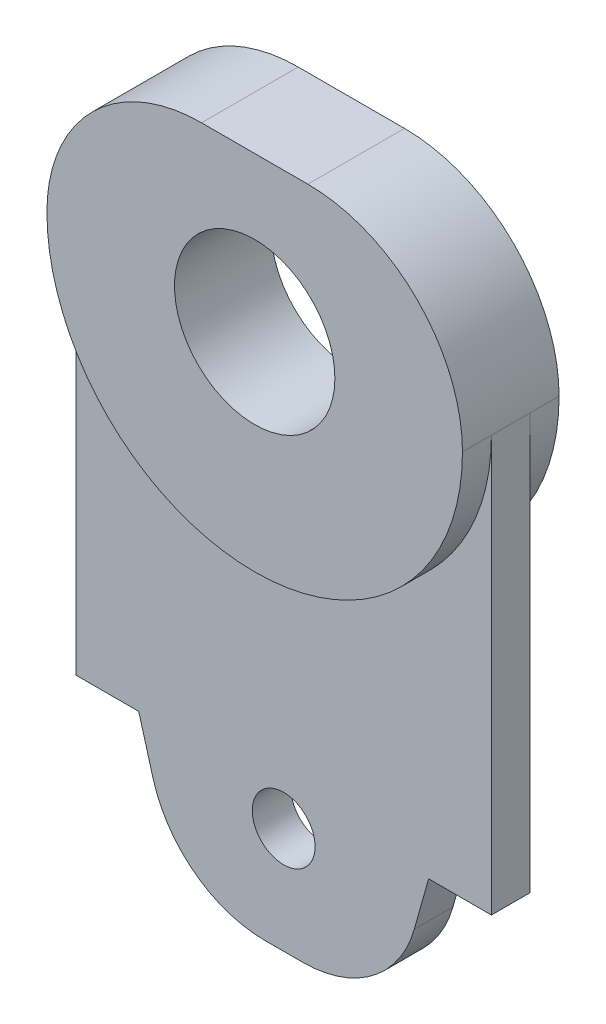
ISO-10303-21;
HEADER;
FILE_DESCRIPTION(('STEP AP214'),'2;1');
FILE_NAME('part.step','',(''),(''),'','','');
FILE_SCHEMA(('AUTOMOTIVE_DESIGN { 1 0 10303 214 1 1 1 1 }'));
ENDSEC;
DATA;
#1=APPLICATION_CONTEXT('core data for automotive mechanical design processes');
#2=APPLICATION_PROTOCOL_DEFINITION('international standard','automotive_design',2000,#1);
#3=PRODUCT_CONTEXT('',#1,'mechanical');
#4=PRODUCT('Part','Part','',(#3));
#5=PRODUCT_RELATED_PRODUCT_CATEGORY('part','',(#4));
#6=PRODUCT_DEFINITION_FORMATION('','',#4);
#7=PRODUCT_DEFINITION_CONTEXT('part definition',#1,'design');
#8=PRODUCT_DEFINITION('design','',#6,#7);
#9=PRODUCT_DEFINITION_SHAPE('','',#8);
#10=(LENGTH_UNIT() NAMED_UNIT(*) SI_UNIT(.MILLI.,.METRE.));
#11=(NAMED_UNIT(*) PLANE_ANGLE_UNIT() SI_UNIT($,.RADIAN.));
#12=(NAMED_UNIT(*) SI_UNIT($,.STERADIAN.) SOLID_ANGLE_UNIT());
#13=UNCERTAINTY_MEASURE_WITH_UNIT(LENGTH_MEASURE(1.E-05),#10,'distance_accuracy_value','');
#14=(GEOMETRIC_REPRESENTATION_CONTEXT(3) GLOBAL_UNCERTAINTY_ASSIGNED_CONTEXT((#13)) GLOBAL_UNIT_ASSIGNED_CONTEXT((#10,
#11,#12)) REPRESENTATION_CONTEXT('',''));
#15=CARTESIAN_POINT('',(0.,0.,0.));
#16=DIRECTION('',(0.,0.,1.));
#17=DIRECTION('',(1.,0.,0.));
#18=AXIS2_PLACEMENT_3D('',#15,#16,#17);
#19=CARTESIAN_POINT('',(8.,21.5,2.));
#20=DIRECTION('',(0.,0.,-1.));
#21=DIRECTION('',(-1.,0.,0.));
#22=AXIS2_PLACEMENT_3D('',#19,#20,#21);
#23=PLANE('',#22);
#24=CARTESIAN_POINT('',(10.75,21.5,2.));
#25=DIRECTION('',(0.,0.,1.));
#26=DIRECTION('',(1.,0.,0.));
#27=AXIS2_PLACEMENT_3D('',#24,#25,#26);
#28=CIRCLE('',#27,10.75);
#29=CARTESIAN_POINT('',(0.,21.5,2.));
#30=VERTEX_POINT('',#29);
#31=CARTESIAN_POINT('',(21.5,21.5,2.));
#32=VERTEX_POINT('',#31);
#33=EDGE_CURVE('E53',#30,#32,#28,.T.);
#34=ORIENTED_EDGE('',*,*,#33,.F.);
#35=DIRECTION('',(0.,-1.,0.));
#36=VECTOR('',#35,1.);
#37=CARTESIAN_POINT('',(0.,0.,2.));
#38=LINE('',#37,#36);
#39=CARTESIAN_POINT('',(0.,0.,2.));
#40=VERTEX_POINT('',#39);
#41=EDGE_CURVE('E167',#30,#40,#38,.T.);
#42=ORIENTED_EDGE('',*,*,#41,.T.);
#43=DIRECTION('',(1.,0.,0.));
#44=VECTOR('',#43,1.);
#45=CARTESIAN_POINT('',(0.,0.,2.));
#46=LINE('',#45,#44);
#47=CARTESIAN_POINT('',(3.25,0.,2.));
#48=VERTEX_POINT('',#47);
#49=EDGE_CURVE('E103',#40,#48,#46,.T.);
#50=ORIENTED_EDGE('',*,*,#49,.T.);
#51=DIRECTION('',(0.271541803681509,-0.96242664595978,0.));
#52=VECTOR('',#51,1.);
#53=CARTESIAN_POINT('',(3.25,0.,2.));
#54=LINE('',#53,#52);
#55=CARTESIAN_POINT('',(3.9918243390894,-2.62925082208903,2.));
#56=VERTEX_POINT('',#55);
#57=EDGE_CURVE('E195',#48,#56,#54,.T.);
#58=ORIENTED_EDGE('',*,*,#57,.T.);
#59=CARTESIAN_POINT('',(9.76638421484809,-1.,2.));
#60=DIRECTION('',(0.,0.,1.));
#61=DIRECTION('',(1.,0.,0.));
#62=AXIS2_PLACEMENT_3D('',#59,#60,#61);
#63=CIRCLE('',#62,6.);
#64=CARTESIAN_POINT('',(9.76638421484813,-7.,2.));
#65=VERTEX_POINT('',#64);
#66=EDGE_CURVE('E211',#56,#65,#63,.T.);
#67=ORIENTED_EDGE('',*,*,#66,.T.);
#68=DIRECTION('',(1.,0.,0.));
#69=VECTOR('',#68,1.);
#70=CARTESIAN_POINT('',(9.76638421484813,-7.,2.));
#71=LINE('',#70,#69);
#72=CARTESIAN_POINT('',(11.7336157851519,-7.,2.));
#73=VERTEX_POINT('',#72);
#74=EDGE_CURVE('E210',#65,#73,#71,.T.);
#75=ORIENTED_EDGE('',*,*,#74,.T.);
#76=CARTESIAN_POINT('',(11.7336157851519,-0.999999999999999,2.));
#77=DIRECTION('',(0.,0.,1.));
#78=DIRECTION('',(-1.,0.,0.));
#79=AXIS2_PLACEMENT_3D('',#76,#77,#78);
#80=CIRCLE('',#79,6.);
#81=CARTESIAN_POINT('',(17.5081756609106,-2.62925082208903,2.));
#82=VERTEX_POINT('',#81);
#83=EDGE_CURVE('E128',#73,#82,#80,.T.);
#84=ORIENTED_EDGE('',*,*,#83,.T.);
#85=DIRECTION('',(0.27154180368151,0.96242664595978,0.));
#86=VECTOR('',#85,1.);
#87=CARTESIAN_POINT('',(18.25,0.,2.));
#88=LINE('',#87,#86);
#89=CARTESIAN_POINT('',(18.25,0.,2.));
#90=VERTEX_POINT('',#89);
#91=EDGE_CURVE('E122',#82,#90,#88,.T.);
#92=ORIENTED_EDGE('',*,*,#91,.T.);
#93=DIRECTION('',(1.,0.,0.));
#94=VECTOR('',#93,1.);
#95=CARTESIAN_POINT('',(18.25,0.,2.));
#96=LINE('',#95,#94);
#97=CARTESIAN_POINT('',(21.5,0.,2.));
#98=VERTEX_POINT('',#97);
#99=EDGE_CURVE('E126',#90,#98,#96,.T.);
#100=ORIENTED_EDGE('',*,*,#99,.T.);
#101=DIRECTION('',(0.,1.,0.));
#102=VECTOR('',#101,1.);
#103=CARTESIAN_POINT('',(21.5,0.,2.));
#104=LINE('',#103,#102);
#105=EDGE_CURVE('E142',#98,#32,#104,.T.);
#106=ORIENTED_EDGE('',*,*,#105,.T.);
#107=EDGE_LOOP('',(#34,#42,#50,#58,#67,#75,#84,#92,#100,#106));
#108=FACE_BOUND('',#107,.T.);
#109=CARTESIAN_POINT('',(10.75,-1.5,2.));
#110=DIRECTION('',(0.,0.,1.));
#111=DIRECTION('',(1.,0.,0.));
#112=AXIS2_PLACEMENT_3D('',#109,#110,#111);
#113=CIRCLE('',#112,1.625);
#114=CARTESIAN_POINT('',(12.375,-1.5,2.));
#115=VERTEX_POINT('',#114);
#116=EDGE_CURVE('E152',#115,#115,#113,.T.);
#117=ORIENTED_EDGE('',*,*,#116,.F.);
#118=EDGE_LOOP('',(#117));
#119=FACE_BOUND('',#118,.T.);
#120=ADVANCED_FACE('F36',(#108,#119),#23,.F.);
#121=CARTESIAN_POINT('',(8.,21.5,0.));
#122=DIRECTION('',(0.,0.,-1.));
#123=DIRECTION('',(-1.,0.,0.));
#124=AXIS2_PLACEMENT_3D('',#121,#122,#123);
#125=PLANE('',#124);
#126=CARTESIAN_POINT('',(10.75,-1.5,0.));
#127=DIRECTION('',(0.,0.,1.));
#128=DIRECTION('',(1.,0.,0.));
#129=AXIS2_PLACEMENT_3D('',#126,#127,#128);
#130=CIRCLE('',#129,1.625);
#131=CARTESIAN_POINT('',(12.375,-1.5,0.));
#132=VERTEX_POINT('',#131);
#133=EDGE_CURVE('E218',#132,#132,#130,.T.);
#134=ORIENTED_EDGE('',*,*,#133,.T.);
#135=EDGE_LOOP('',(#134));
#136=FACE_BOUND('',#135,.T.);
#137=DIRECTION('',(0.,-1.,0.));
#138=VECTOR('',#137,1.);
#139=CARTESIAN_POINT('',(0.,0.,0.));
#140=LINE('',#139,#138);
#141=CARTESIAN_POINT('',(0.,21.5,0.));
#142=VERTEX_POINT('',#141);
#143=CARTESIAN_POINT('',(0.,0.,0.));
#144=VERTEX_POINT('',#143);
#145=EDGE_CURVE('E148',#142,#144,#140,.T.);
#146=ORIENTED_EDGE('',*,*,#145,.F.);
#147=CARTESIAN_POINT('',(10.75,21.5,0.));
#148=DIRECTION('',(0.,0.,1.));
#149=DIRECTION('',(1.,0.,0.));
#150=AXIS2_PLACEMENT_3D('',#147,#148,#149);
#151=CIRCLE('',#150,10.75);
#152=CARTESIAN_POINT('',(21.5,21.5,0.));
#153=VERTEX_POINT('',#152);
#154=EDGE_CURVE('E228',#142,#153,#151,.T.);
#155=ORIENTED_EDGE('',*,*,#154,.T.);
#156=DIRECTION('',(0.,1.,0.));
#157=VECTOR('',#156,1.);
#158=CARTESIAN_POINT('',(21.5,0.,0.));
#159=LINE('',#158,#157);
#160=CARTESIAN_POINT('',(21.5,0.,0.));
#161=VERTEX_POINT('',#160);
#162=EDGE_CURVE('E164',#161,#153,#159,.T.);
#163=ORIENTED_EDGE('',*,*,#162,.F.);
#164=DIRECTION('',(1.,0.,0.));
#165=VECTOR('',#164,1.);
#166=CARTESIAN_POINT('',(18.25,0.,0.));
#167=LINE('',#166,#165);
#168=CARTESIAN_POINT('',(18.25,0.,0.));
#169=VERTEX_POINT('',#168);
#170=EDGE_CURVE('E87',#169,#161,#167,.T.);
#171=ORIENTED_EDGE('',*,*,#170,.F.);
#172=DIRECTION('',(0.27154180368151,0.96242664595978,0.));
#173=VECTOR('',#172,1.);
#174=CARTESIAN_POINT('',(18.25,0.,0.));
#175=LINE('',#174,#173);
#176=CARTESIAN_POINT('',(17.5081756609106,-2.62925082208903,0.));
#177=VERTEX_POINT('',#176);
#178=EDGE_CURVE('E136',#177,#169,#175,.T.);
#179=ORIENTED_EDGE('',*,*,#178,.F.);
#180=CARTESIAN_POINT('',(11.7336157851519,-0.999999999999999,0.));
#181=DIRECTION('',(0.,0.,1.));
#182=DIRECTION('',(-1.,0.,0.));
#183=AXIS2_PLACEMENT_3D('',#180,#181,#182);
#184=CIRCLE('',#183,6.);
#185=CARTESIAN_POINT('',(11.7336157851519,-7.,0.));
#186=VERTEX_POINT('',#185);
#187=EDGE_CURVE('E160',#186,#177,#184,.T.);
#188=ORIENTED_EDGE('',*,*,#187,.F.);
#189=DIRECTION('',(1.,0.,0.));
#190=VECTOR('',#189,1.);
#191=CARTESIAN_POINT('',(9.76638421484813,-7.,0.));
#192=LINE('',#191,#190);
#193=CARTESIAN_POINT('',(9.76638421484813,-7.,0.));
#194=VERTEX_POINT('',#193);
#195=EDGE_CURVE('E158',#194,#186,#192,.T.);
#196=ORIENTED_EDGE('',*,*,#195,.F.);
#197=CARTESIAN_POINT('',(9.76638421484809,-1.,0.));
#198=DIRECTION('',(0.,0.,1.));
#199=DIRECTION('',(1.,0.,0.));
#200=AXIS2_PLACEMENT_3D('',#197,#198,#199);
#201=CIRCLE('',#200,6.);
#202=CARTESIAN_POINT('',(3.9918243390894,-2.62925082208903,0.));
#203=VERTEX_POINT('',#202);
#204=EDGE_CURVE('E156',#203,#194,#201,.T.);
#205=ORIENTED_EDGE('',*,*,#204,.F.);
#206=DIRECTION('',(0.271541803681509,-0.96242664595978,0.));
#207=VECTOR('',#206,1.);
#208=CARTESIAN_POINT('',(3.25,0.,0.));
#209=LINE('',#208,#207);
#210=CARTESIAN_POINT('',(3.25,0.,0.));
#211=VERTEX_POINT('',#210);
#212=EDGE_CURVE('E154',#211,#203,#209,.T.);
#213=ORIENTED_EDGE('',*,*,#212,.F.);
#214=DIRECTION('',(1.,0.,0.));
#215=VECTOR('',#214,1.);
#216=CARTESIAN_POINT('',(0.,0.,0.));
#217=LINE('',#216,#215);
#218=EDGE_CURVE('E151',#144,#211,#217,.T.);
#219=ORIENTED_EDGE('',*,*,#218,.F.);
#220=EDGE_LOOP('',(#146,#155,#163,#171,#179,#188,#196,#205,#213,#219));
#221=FACE_BOUND('',#220,.T.);
#222=ADVANCED_FACE('F199',(#136,#221),#125,.T.);
#223=CARTESIAN_POINT('',(0.,0.,2.));
#224=DIRECTION('',(1.,0.,0.));
#225=DIRECTION('',(0.,0.,-1.));
#226=AXIS2_PLACEMENT_3D('',#223,#224,#225);
#227=PLANE('',#226);
#228=ORIENTED_EDGE('',*,*,#145,.T.);
#229=DIRECTION('',(0.,0.,-1.));
#230=VECTOR('',#229,1.);
#231=CARTESIAN_POINT('',(0.,0.,2.));
#232=LINE('',#231,#230);
#233=EDGE_CURVE('E11',#40,#144,#232,.T.);
#234=ORIENTED_EDGE('',*,*,#233,.F.);
#235=ORIENTED_EDGE('',*,*,#41,.F.);
#236=DIRECTION('',(0.,0.,-1.));
#237=VECTOR('',#236,1.);
#238=CARTESIAN_POINT('',(0.,21.5,2.));
#239=LINE('',#238,#237);
#240=EDGE_CURVE('E144',#30,#142,#239,.T.);
#241=ORIENTED_EDGE('',*,*,#240,.T.);
#242=EDGE_LOOP('',(#228,#234,#235,#241));
#243=FACE_BOUND('',#242,.T.);
#244=ADVANCED_FACE('F38',(#243),#227,.F.);
#245=CARTESIAN_POINT('',(0.,0.,2.));
#246=DIRECTION('',(0.,1.,0.));
#247=DIRECTION('',(0.,0.,1.));
#248=AXIS2_PLACEMENT_3D('',#245,#246,#247);
#249=PLANE('',#248);
#250=ORIENTED_EDGE('',*,*,#218,.T.);
#251=DIRECTION('',(0.,0.,-1.));
#252=VECTOR('',#251,1.);
#253=CARTESIAN_POINT('',(3.25,0.,2.));
#254=LINE('',#253,#252);
#255=EDGE_CURVE('E45',#48,#211,#254,.T.);
#256=ORIENTED_EDGE('',*,*,#255,.F.);
#257=ORIENTED_EDGE('',*,*,#49,.F.);
#258=ORIENTED_EDGE('',*,*,#233,.T.);
#259=EDGE_LOOP('',(#250,#256,#257,#258));
#260=FACE_BOUND('',#259,.T.);
#261=ADVANCED_FACE('F474',(#260),#249,.F.);
#262=CARTESIAN_POINT('',(3.25,0.,2.));
#263=DIRECTION('',(0.962426645959781,0.271541803681509,0.));
#264=DIRECTION('',(-0.271541803681509,0.962426645959781,0.));
#265=AXIS2_PLACEMENT_3D('',#262,#263,#264);
#266=PLANE('',#265);
#267=ORIENTED_EDGE('',*,*,#212,.T.);
#268=DIRECTION('',(0.,0.,-1.));
#269=VECTOR('',#268,1.);
#270=CARTESIAN_POINT('',(3.9918243390894,-2.62925082208903,2.));
#271=LINE('',#270,#269);
#272=EDGE_CURVE('E187',#56,#203,#271,.T.);
#273=ORIENTED_EDGE('',*,*,#272,.F.);
#274=ORIENTED_EDGE('',*,*,#57,.F.);
#275=ORIENTED_EDGE('',*,*,#255,.T.);
#276=EDGE_LOOP('',(#267,#273,#274,#275));
#277=FACE_BOUND('',#276,.T.);
#278=ADVANCED_FACE('F193',(#277),#266,.F.);
#279=CARTESIAN_POINT('',(9.76638421484809,-1.,2.));
#280=DIRECTION('',(0.,0.,-1.));
#281=DIRECTION('',(-1.,0.,0.));
#282=AXIS2_PLACEMENT_3D('',#279,#280,#281);
#283=CYLINDRICAL_SURFACE('',#282,6.);
#284=ORIENTED_EDGE('',*,*,#204,.T.);
#285=DIRECTION('',(0.,0.,-1.));
#286=VECTOR('',#285,1.);
#287=CARTESIAN_POINT('',(9.76638421484813,-7.,2.));
#288=LINE('',#287,#286);
#289=EDGE_CURVE('E184',#65,#194,#288,.T.);
#290=ORIENTED_EDGE('',*,*,#289,.F.);
#291=ORIENTED_EDGE('',*,*,#66,.F.);
#292=ORIENTED_EDGE('',*,*,#272,.T.);
#293=EDGE_LOOP('',(#284,#290,#291,#292));
#294=FACE_BOUND('',#293,.T.);
#295=ADVANCED_FACE('F204',(#294),#283,.T.);
#296=CARTESIAN_POINT('',(9.76638421484813,-7.,2.));
#297=DIRECTION('',(0.,1.,0.));
#298=DIRECTION('',(0.,0.,1.));
#299=AXIS2_PLACEMENT_3D('',#296,#297,#298);
#300=PLANE('',#299);
#301=ORIENTED_EDGE('',*,*,#195,.T.);
#302=DIRECTION('',(0.,0.,-1.));
#303=VECTOR('',#302,1.);
#304=CARTESIAN_POINT('',(11.7336157851519,-7.,2.));
#305=LINE('',#304,#303);
#306=EDGE_CURVE('E181',#73,#186,#305,.T.);
#307=ORIENTED_EDGE('',*,*,#306,.F.);
#308=ORIENTED_EDGE('',*,*,#74,.F.);
#309=ORIENTED_EDGE('',*,*,#289,.T.);
#310=EDGE_LOOP('',(#301,#307,#308,#309));
#311=FACE_BOUND('',#310,.T.);
#312=ADVANCED_FACE('F208',(#311),#300,.F.);
#313=CARTESIAN_POINT('',(11.7336157851519,-0.999999999999999,2.));
#314=DIRECTION('',(0.,0.,-1.));
#315=DIRECTION('',(-1.,0.,0.));
#316=AXIS2_PLACEMENT_3D('',#313,#314,#315);
#317=CYLINDRICAL_SURFACE('',#316,6.);
#318=ORIENTED_EDGE('',*,*,#187,.T.);
#319=DIRECTION('',(0.,0.,-1.));
#320=VECTOR('',#319,1.);
#321=CARTESIAN_POINT('',(17.5081756609106,-2.62925082208903,2.));
#322=LINE('',#321,#320);
#323=EDGE_CURVE('E137',#82,#177,#322,.T.);
#324=ORIENTED_EDGE('',*,*,#323,.F.);
#325=ORIENTED_EDGE('',*,*,#83,.F.);
#326=ORIENTED_EDGE('',*,*,#306,.T.);
#327=EDGE_LOOP('',(#318,#324,#325,#326));
#328=FACE_BOUND('',#327,.T.);
#329=ADVANCED_FACE('F440',(#328),#317,.T.);
#330=CARTESIAN_POINT('',(18.25,0.,2.));
#331=DIRECTION('',(-0.962426645959781,0.27154180368151,0.));
#332=DIRECTION('',(-0.27154180368151,-0.96242664595978,0.));
#333=AXIS2_PLACEMENT_3D('',#330,#331,#332);
#334=PLANE('',#333);
#335=ORIENTED_EDGE('',*,*,#178,.T.);
#336=DIRECTION('',(0.,0.,-1.));
#337=VECTOR('',#336,1.);
#338=CARTESIAN_POINT('',(18.25,0.,2.));
#339=LINE('',#338,#337);
#340=EDGE_CURVE('E133',#90,#169,#339,.T.);
#341=ORIENTED_EDGE('',*,*,#340,.F.);
#342=ORIENTED_EDGE('',*,*,#91,.F.);
#343=ORIENTED_EDGE('',*,*,#323,.T.);
#344=EDGE_LOOP('',(#335,#341,#342,#343));
#345=FACE_BOUND('',#344,.T.);
#346=ADVANCED_FACE('F134',(#345),#334,.F.);
#347=CARTESIAN_POINT('',(18.25,0.,2.));
#348=DIRECTION('',(0.,1.,0.));
#349=DIRECTION('',(0.,0.,1.));
#350=AXIS2_PLACEMENT_3D('',#347,#348,#349);
#351=PLANE('',#350);
#352=ORIENTED_EDGE('',*,*,#170,.T.);
#353=DIRECTION('',(0.,0.,-1.));
#354=VECTOR('',#353,1.);
#355=CARTESIAN_POINT('',(21.5,0.,2.));
#356=LINE('',#355,#354);
#357=EDGE_CURVE('E138',#98,#161,#356,.T.);
#358=ORIENTED_EDGE('',*,*,#357,.F.);
#359=ORIENTED_EDGE('',*,*,#99,.F.);
#360=ORIENTED_EDGE('',*,*,#340,.T.);
#361=EDGE_LOOP('',(#352,#358,#359,#360));
#362=FACE_BOUND('',#361,.T.);
#363=ADVANCED_FACE('F140',(#362),#351,.F.);
#364=CARTESIAN_POINT('',(21.5,0.,2.));
#365=DIRECTION('',(-1.,0.,0.));
#366=DIRECTION('',(0.,0.,1.));
#367=AXIS2_PLACEMENT_3D('',#364,#365,#366);
#368=PLANE('',#367);
#369=ORIENTED_EDGE('',*,*,#162,.T.);
#370=DIRECTION('',(0.,0.,-1.));
#371=VECTOR('',#370,1.);
#372=CARTESIAN_POINT('',(21.5,21.5,2.));
#373=LINE('',#372,#371);
#374=EDGE_CURVE('E176',#32,#153,#373,.T.);
#375=ORIENTED_EDGE('',*,*,#374,.F.);
#376=ORIENTED_EDGE('',*,*,#105,.F.);
#377=ORIENTED_EDGE('',*,*,#357,.T.);
#378=EDGE_LOOP('',(#369,#375,#376,#377));
#379=FACE_BOUND('',#378,.T.);
#380=ADVANCED_FACE('F322',(#379),#368,.F.);
#381=CARTESIAN_POINT('',(13.5,21.5,2.));
#382=DIRECTION('',(0.,0.,-1.));
#383=DIRECTION('',(-1.,0.,0.));
#384=AXIS2_PLACEMENT_3D('',#381,#382,#383);
#385=CYLINDRICAL_SURFACE('',#384,8.);
#386=ORIENTED_EDGE('',*,*,#374,.T.);
#387=DIRECTION('',(0.,0.,1.));
#388=VECTOR('',#387,1.);
#389=CARTESIAN_POINT('',(21.5,21.5,-1.5));
#390=LINE('',#389,#388);
#391=CARTESIAN_POINT('',(21.5,21.5,-1.5));
#392=VERTEX_POINT('',#391);
#393=EDGE_CURVE('E95',#392,#153,#390,.T.);
#394=ORIENTED_EDGE('',*,*,#393,.F.);
#395=CARTESIAN_POINT('',(13.5,21.5,-1.5));
#396=DIRECTION('',(0.,0.,1.));
#397=DIRECTION('',(1.,0.,0.));
#398=AXIS2_PLACEMENT_3D('',#395,#396,#397);
#399=CIRCLE('',#398,8.);
#400=CARTESIAN_POINT('',(13.5,29.5,-1.5));
#401=VERTEX_POINT('',#400);
#402=EDGE_CURVE('E237',#392,#401,#399,.T.);
#403=ORIENTED_EDGE('',*,*,#402,.T.);
#404=DIRECTION('',(0.,0.,-1.));
#405=VECTOR('',#404,1.);
#406=CARTESIAN_POINT('',(13.5,29.5,2.));
#407=LINE('',#406,#405);
#408=CARTESIAN_POINT('',(13.5,29.5,3.5));
#409=VERTEX_POINT('',#408);
#410=EDGE_CURVE('E173',#409,#401,#407,.T.);
#411=ORIENTED_EDGE('',*,*,#410,.F.);
#412=CARTESIAN_POINT('',(13.5,21.5,3.5));
#413=DIRECTION('',(0.,0.,1.));
#414=DIRECTION('',(1.,0.,0.));
#415=AXIS2_PLACEMENT_3D('',#412,#413,#414);
#416=CIRCLE('',#415,8.);
#417=CARTESIAN_POINT('',(21.5,21.5,3.5));
#418=VERTEX_POINT('',#417);
#419=EDGE_CURVE('E247',#418,#409,#416,.T.);
#420=ORIENTED_EDGE('',*,*,#419,.F.);
#421=DIRECTION('',(0.,0.,-1.));
#422=VECTOR('',#421,1.);
#423=CARTESIAN_POINT('',(21.5,21.5,3.5));
#424=LINE('',#423,#422);
#425=EDGE_CURVE('E231',#418,#32,#424,.T.);
#426=ORIENTED_EDGE('',*,*,#425,.T.);
#427=EDGE_LOOP('',(#386,#394,#403,#411,#420,#426));
#428=FACE_BOUND('',#427,.T.);
#429=ADVANCED_FACE('F286',(#428),#385,.T.);
#430=CARTESIAN_POINT('',(8.,29.5,2.));
#431=DIRECTION('',(0.,-1.,0.));
#432=DIRECTION('',(0.,0.,-1.));
#433=AXIS2_PLACEMENT_3D('',#430,#431,#432);
#434=PLANE('',#433);
#435=ORIENTED_EDGE('',*,*,#410,.T.);
#436=DIRECTION('',(-1.,0.,0.));
#437=VECTOR('',#436,1.);
#438=CARTESIAN_POINT('',(0.,29.5,-1.5));
#439=LINE('',#438,#437);
#440=CARTESIAN_POINT('',(8.,29.5,-1.5));
#441=VERTEX_POINT('',#440);
#442=EDGE_CURVE('E234',#401,#441,#439,.T.);
#443=ORIENTED_EDGE('',*,*,#442,.T.);
#444=DIRECTION('',(0.,0.,-1.));
#445=VECTOR('',#444,1.);
#446=CARTESIAN_POINT('',(8.,29.5,2.));
#447=LINE('',#446,#445);
#448=CARTESIAN_POINT('',(8.,29.5,3.5));
#449=VERTEX_POINT('',#448);
#450=EDGE_CURVE('E170',#449,#441,#447,.T.);
#451=ORIENTED_EDGE('',*,*,#450,.F.);
#452=DIRECTION('',(-1.,0.,0.));
#453=VECTOR('',#452,1.);
#454=CARTESIAN_POINT('',(0.,29.5,3.5));
#455=LINE('',#454,#453);
#456=EDGE_CURVE('E254',#409,#449,#455,.T.);
#457=ORIENTED_EDGE('',*,*,#456,.F.);
#458=EDGE_LOOP('',(#435,#443,#451,#457));
#459=FACE_BOUND('',#458,.T.);
#460=ADVANCED_FACE('F312',(#459),#434,.F.);
#461=CARTESIAN_POINT('',(8.,21.5,2.));
#462=DIRECTION('',(0.,0.,-1.));
#463=DIRECTION('',(-1.,0.,0.));
#464=AXIS2_PLACEMENT_3D('',#461,#462,#463);
#465=CYLINDRICAL_SURFACE('',#464,8.);
#466=ORIENTED_EDGE('',*,*,#450,.T.);
#467=CARTESIAN_POINT('',(8.,21.5,-1.5));
#468=DIRECTION('',(0.,0.,1.));
#469=DIRECTION('',(1.,0.,0.));
#470=AXIS2_PLACEMENT_3D('',#467,#468,#469);
#471=CIRCLE('',#470,8.);
#472=CARTESIAN_POINT('',(0.,21.5,-1.5));
#473=VERTEX_POINT('',#472);
#474=EDGE_CURVE('E225',#441,#473,#471,.T.);
#475=ORIENTED_EDGE('',*,*,#474,.T.);
#476=DIRECTION('',(0.,0.,1.));
#477=VECTOR('',#476,1.);
#478=CARTESIAN_POINT('',(0.,21.5,-1.5));
#479=LINE('',#478,#477);
#480=EDGE_CURVE('E221',#473,#142,#479,.T.);
#481=ORIENTED_EDGE('',*,*,#480,.T.);
#482=ORIENTED_EDGE('',*,*,#240,.F.);
#483=DIRECTION('',(0.,0.,-1.));
#484=VECTOR('',#483,1.);
#485=CARTESIAN_POINT('',(0.,21.5,3.5));
#486=LINE('',#485,#484);
#487=CARTESIAN_POINT('',(0.,21.5,3.5));
#488=VERTEX_POINT('',#487);
#489=EDGE_CURVE('E244',#488,#30,#486,.T.);
#490=ORIENTED_EDGE('',*,*,#489,.F.);
#491=CARTESIAN_POINT('',(8.,21.5,3.5));
#492=DIRECTION('',(0.,0.,1.));
#493=DIRECTION('',(1.,0.,0.));
#494=AXIS2_PLACEMENT_3D('',#491,#492,#493);
#495=CIRCLE('',#494,8.);
#496=EDGE_CURVE('E257',#449,#488,#495,.T.);
#497=ORIENTED_EDGE('',*,*,#496,.F.);
#498=EDGE_LOOP('',(#466,#475,#481,#482,#490,#497));
#499=FACE_BOUND('',#498,.T.);
#500=ADVANCED_FACE('F309',(#499),#465,.T.);
#501=CARTESIAN_POINT('',(10.75,-1.5,2.));
#502=DIRECTION('',(0.,0.,-1.));
#503=DIRECTION('',(-1.,0.,0.));
#504=AXIS2_PLACEMENT_3D('',#501,#502,#503);
#505=CYLINDRICAL_SURFACE('',#504,1.625);
#506=ORIENTED_EDGE('',*,*,#116,.T.);
#507=EDGE_LOOP('',(#506));
#508=FACE_BOUND('',#507,.T.);
#509=ORIENTED_EDGE('',*,*,#133,.F.);
#510=EDGE_LOOP('',(#509));
#511=FACE_BOUND('',#510,.T.);
#512=ADVANCED_FACE('F320',(#508,#511),#505,.F.);
#513=CARTESIAN_POINT('',(10.75,21.5,2.));
#514=DIRECTION('',(0.,0.,-1.));
#515=DIRECTION('',(-1.,0.,0.));
#516=AXIS2_PLACEMENT_3D('',#513,#514,#515);
#517=CYLINDRICAL_SURFACE('',#516,4.15);
#518=CARTESIAN_POINT('',(10.75,21.5,-1.5));
#519=DIRECTION('',(0.,0.,1.));
#520=DIRECTION('',(1.,0.,0.));
#521=AXIS2_PLACEMENT_3D('',#518,#519,#520);
#522=CIRCLE('',#521,4.15);
#523=CARTESIAN_POINT('',(14.9,21.5,-1.5));
#524=VERTEX_POINT('',#523);
#525=EDGE_CURVE('E230',#524,#524,#522,.T.);
#526=ORIENTED_EDGE('',*,*,#525,.F.);
#527=EDGE_LOOP('',(#526));
#528=FACE_BOUND('',#527,.T.);
#529=CARTESIAN_POINT('',(10.75,21.5,3.5));
#530=DIRECTION('',(0.,0.,1.));
#531=DIRECTION('',(1.,0.,0.));
#532=AXIS2_PLACEMENT_3D('',#529,#530,#531);
#533=CIRCLE('',#532,4.15);
#534=CARTESIAN_POINT('',(14.9,21.5,3.5));
#535=VERTEX_POINT('',#534);
#536=EDGE_CURVE('E251',#535,#535,#533,.T.);
#537=ORIENTED_EDGE('',*,*,#536,.T.);
#538=EDGE_LOOP('',(#537));
#539=FACE_BOUND('',#538,.T.);
#540=ADVANCED_FACE('F266',(#528,#539),#517,.F.);
#541=CARTESIAN_POINT('',(10.75,21.5,-1.5));
#542=DIRECTION('',(0.,0.,1.));
#543=DIRECTION('',(1.,0.,0.));
#544=AXIS2_PLACEMENT_3D('',#541,#542,#543);
#545=CYLINDRICAL_SURFACE('',#544,10.75);
#546=ORIENTED_EDGE('',*,*,#154,.F.);
#547=ORIENTED_EDGE('',*,*,#480,.F.);
#548=CARTESIAN_POINT('',(10.75,21.5,-1.5));
#549=DIRECTION('',(0.,0.,1.));
#550=DIRECTION('',(1.,0.,0.));
#551=AXIS2_PLACEMENT_3D('',#548,#549,#550);
#552=CIRCLE('',#551,10.75);
#553=EDGE_CURVE('E240',#473,#392,#552,.T.);
#554=ORIENTED_EDGE('',*,*,#553,.T.);
#555=ORIENTED_EDGE('',*,*,#393,.T.);
#556=EDGE_LOOP('',(#546,#547,#554,#555));
#557=FACE_BOUND('',#556,.T.);
#558=ADVANCED_FACE('F302',(#557),#545,.T.);
#559=CARTESIAN_POINT('',(0.,0.,-1.5));
#560=DIRECTION('',(0.,0.,1.));
#561=DIRECTION('',(1.,0.,0.));
#562=AXIS2_PLACEMENT_3D('',#559,#560,#561);
#563=PLANE('',#562);
#564=ORIENTED_EDGE('',*,*,#525,.T.);
#565=EDGE_LOOP('',(#564));
#566=FACE_BOUND('',#565,.T.);
#567=ORIENTED_EDGE('',*,*,#553,.F.);
#568=ORIENTED_EDGE('',*,*,#474,.F.);
#569=ORIENTED_EDGE('',*,*,#442,.F.);
#570=ORIENTED_EDGE('',*,*,#402,.F.);
#571=EDGE_LOOP('',(#567,#568,#569,#570));
#572=FACE_BOUND('',#571,.T.);
#573=ADVANCED_FACE('F307',(#566,#572),#563,.F.);
#574=CARTESIAN_POINT('',(10.75,21.5,3.5));
#575=DIRECTION('',(0.,0.,-1.));
#576=DIRECTION('',(-1.,0.,0.));
#577=AXIS2_PLACEMENT_3D('',#574,#575,#576);
#578=CYLINDRICAL_SURFACE('',#577,10.75);
#579=ORIENTED_EDGE('',*,*,#33,.T.);
#580=ORIENTED_EDGE('',*,*,#425,.F.);
#581=CARTESIAN_POINT('',(10.75,21.5,3.5));
#582=DIRECTION('',(0.,0.,1.));
#583=DIRECTION('',(1.,0.,0.));
#584=AXIS2_PLACEMENT_3D('',#581,#582,#583);
#585=CIRCLE('',#584,10.75);
#586=EDGE_CURVE('E260',#488,#418,#585,.T.);
#587=ORIENTED_EDGE('',*,*,#586,.F.);
#588=ORIENTED_EDGE('',*,*,#489,.T.);
#589=EDGE_LOOP('',(#579,#580,#587,#588));
#590=FACE_BOUND('',#589,.T.);
#591=ADVANCED_FACE('F271',(#590),#578,.T.);
#592=CARTESIAN_POINT('',(0.,0.,3.5));
#593=DIRECTION('',(0.,0.,-1.));
#594=DIRECTION('',(1.,0.,0.));
#595=AXIS2_PLACEMENT_3D('',#592,#593,#594);
#596=PLANE('',#595);
#597=ORIENTED_EDGE('',*,*,#536,.F.);
#598=EDGE_LOOP('',(#597));
#599=FACE_BOUND('',#598,.T.);
#600=ORIENTED_EDGE('',*,*,#586,.T.);
#601=ORIENTED_EDGE('',*,*,#419,.T.);
#602=ORIENTED_EDGE('',*,*,#456,.T.);
#603=ORIENTED_EDGE('',*,*,#496,.T.);
#604=EDGE_LOOP('',(#600,#601,#602,#603));
#605=FACE_BOUND('',#604,.T.);
#606=ADVANCED_FACE('F268',(#599,#605),#596,.F.);
#607=CLOSED_SHELL('',(#120,#222,#244,#261,#278,#295,#312,#329,#346,#363,#380,#429,#460,#500,
#512,#540,#558,#573,#591,#606));
#608=MANIFOLD_SOLID_BREP('B2',#607);
#609=ADVANCED_BREP_SHAPE_REPRESENTATION('',(#18,#608),#14);
#610=SHAPE_DEFINITION_REPRESENTATION(#9,#609);
ENDSEC;
END-ISO-10303-21;
